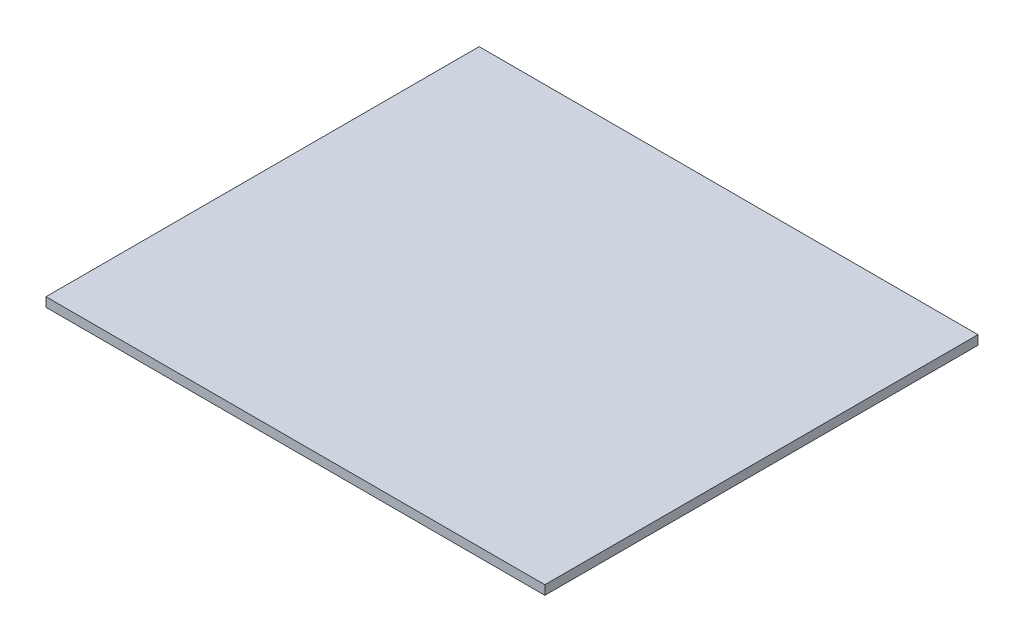
ISO-10303-21;
HEADER;
FILE_DESCRIPTION(('STEP AP214'),'2;1');
FILE_NAME('part.step','',(''),(''),'','','');
FILE_SCHEMA(('AUTOMOTIVE_DESIGN { 1 0 10303 214 1 1 1 1 }'));
ENDSEC;
DATA;
#1=APPLICATION_CONTEXT('core data for automotive mechanical design processes');
#2=APPLICATION_PROTOCOL_DEFINITION('international standard','automotive_design',2000,#1);
#3=PRODUCT_CONTEXT('',#1,'mechanical');
#4=PRODUCT('Part','Part','',(#3));
#5=PRODUCT_RELATED_PRODUCT_CATEGORY('part','',(#4));
#6=PRODUCT_DEFINITION_FORMATION('','',#4);
#7=PRODUCT_DEFINITION_CONTEXT('part definition',#1,'design');
#8=PRODUCT_DEFINITION('design','',#6,#7);
#9=PRODUCT_DEFINITION_SHAPE('','',#8);
#10=(LENGTH_UNIT() NAMED_UNIT(*) SI_UNIT(.MILLI.,.METRE.));
#11=(NAMED_UNIT(*) PLANE_ANGLE_UNIT() SI_UNIT($,.RADIAN.));
#12=(NAMED_UNIT(*) SI_UNIT($,.STERADIAN.) SOLID_ANGLE_UNIT());
#13=UNCERTAINTY_MEASURE_WITH_UNIT(LENGTH_MEASURE(1.E-05),#10,'distance_accuracy_value','');
#14=(GEOMETRIC_REPRESENTATION_CONTEXT(3) GLOBAL_UNCERTAINTY_ASSIGNED_CONTEXT((#13)) GLOBAL_UNIT_ASSIGNED_CONTEXT((#10,
#11,#12)) REPRESENTATION_CONTEXT('',''));
#15=CARTESIAN_POINT('',(0.,0.,0.));
#16=DIRECTION('',(0.,0.,1.));
#17=DIRECTION('',(1.,0.,0.));
#18=AXIS2_PLACEMENT_3D('',#15,#16,#17);
#19=CARTESIAN_POINT('',(515.874,19.05,-447.929));
#20=DIRECTION('',(-1.,0.,0.));
#21=DIRECTION('',(0.,0.,1.));
#22=AXIS2_PLACEMENT_3D('',#19,#20,#21);
#23=PLANE('',#22);
#24=DIRECTION('',(0.,0.,-1.));
#25=VECTOR('',#24,1.);
#26=CARTESIAN_POINT('',(515.874,0.,-447.929));
#27=LINE('',#26,#25);
#28=CARTESIAN_POINT('',(515.874,0.,447.929));
#29=VERTEX_POINT('',#28);
#30=CARTESIAN_POINT('',(515.874,0.,-447.929));
#31=VERTEX_POINT('',#30);
#32=EDGE_CURVE('E96',#29,#31,#27,.T.);
#33=ORIENTED_EDGE('',*,*,#32,.T.);
#34=DIRECTION('',(0.,-1.,0.));
#35=VECTOR('',#34,1.);
#36=CARTESIAN_POINT('',(515.874,19.05,-447.929));
#37=LINE('',#36,#35);
#38=CARTESIAN_POINT('',(515.874,19.05,-447.929));
#39=VERTEX_POINT('',#38);
#40=EDGE_CURVE('E11',#39,#31,#37,.T.);
#41=ORIENTED_EDGE('',*,*,#40,.F.);
#42=DIRECTION('',(0.,0.,-1.));
#43=VECTOR('',#42,1.);
#44=CARTESIAN_POINT('',(515.874,19.05,-447.929));
#45=LINE('',#44,#43);
#46=CARTESIAN_POINT('',(515.874,19.05,447.929));
#47=VERTEX_POINT('',#46);
#48=EDGE_CURVE('E84',#47,#39,#45,.T.);
#49=ORIENTED_EDGE('',*,*,#48,.F.);
#50=DIRECTION('',(0.,-1.,0.));
#51=VECTOR('',#50,1.);
#52=CARTESIAN_POINT('',(515.874,19.05,447.929));
#53=LINE('',#52,#51);
#54=EDGE_CURVE('E92',#47,#29,#53,.T.);
#55=ORIENTED_EDGE('',*,*,#54,.T.);
#56=EDGE_LOOP('',(#33,#41,#49,#55));
#57=FACE_BOUND('',#56,.T.);
#58=ADVANCED_FACE('F33',(#57),#23,.F.);
#59=CARTESIAN_POINT('',(-515.874,19.05,-447.929));
#60=DIRECTION('',(0.,0.,1.));
#61=DIRECTION('',(1.,0.,0.));
#62=AXIS2_PLACEMENT_3D('',#59,#60,#61);
#63=PLANE('',#62);
#64=DIRECTION('',(-1.,0.,0.));
#65=VECTOR('',#64,1.);
#66=CARTESIAN_POINT('',(-515.874,0.,-447.929));
#67=LINE('',#66,#65);
#68=CARTESIAN_POINT('',(-515.874,0.,-447.929));
#69=VERTEX_POINT('',#68);
#70=EDGE_CURVE('E88',#31,#69,#67,.T.);
#71=ORIENTED_EDGE('',*,*,#70,.T.);
#72=DIRECTION('',(0.,-1.,0.));
#73=VECTOR('',#72,1.);
#74=CARTESIAN_POINT('',(-515.874,19.05,-447.929));
#75=LINE('',#74,#73);
#76=CARTESIAN_POINT('',(-515.874,19.05,-447.929));
#77=VERTEX_POINT('',#76);
#78=EDGE_CURVE('E41',#77,#69,#75,.T.);
#79=ORIENTED_EDGE('',*,*,#78,.F.);
#80=DIRECTION('',(-1.,0.,0.));
#81=VECTOR('',#80,1.);
#82=CARTESIAN_POINT('',(-515.874,19.05,-447.929));
#83=LINE('',#82,#81);
#84=EDGE_CURVE('E79',#39,#77,#83,.T.);
#85=ORIENTED_EDGE('',*,*,#84,.F.);
#86=ORIENTED_EDGE('',*,*,#40,.T.);
#87=EDGE_LOOP('',(#71,#79,#85,#86));
#88=FACE_BOUND('',#87,.T.);
#89=ADVANCED_FACE('F87',(#88),#63,.F.);
#90=CARTESIAN_POINT('',(-515.874,19.05,-447.929));
#91=DIRECTION('',(1.,0.,0.));
#92=DIRECTION('',(0.,0.,-1.));
#93=AXIS2_PLACEMENT_3D('',#90,#91,#92);
#94=PLANE('',#93);
#95=DIRECTION('',(0.,0.,1.));
#96=VECTOR('',#95,1.);
#97=CARTESIAN_POINT('',(-515.874,0.,-447.929));
#98=LINE('',#97,#96);
#99=CARTESIAN_POINT('',(-515.874,0.,447.929));
#100=VERTEX_POINT('',#99);
#101=EDGE_CURVE('E66',#69,#100,#98,.T.);
#102=ORIENTED_EDGE('',*,*,#101,.T.);
#103=DIRECTION('',(0.,-1.,0.));
#104=VECTOR('',#103,1.);
#105=CARTESIAN_POINT('',(-515.874,19.05,447.929));
#106=LINE('',#105,#104);
#107=CARTESIAN_POINT('',(-515.874,19.05,447.929));
#108=VERTEX_POINT('',#107);
#109=EDGE_CURVE('E89',#108,#100,#106,.T.);
#110=ORIENTED_EDGE('',*,*,#109,.F.);
#111=DIRECTION('',(0.,0.,1.));
#112=VECTOR('',#111,1.);
#113=CARTESIAN_POINT('',(-515.874,19.05,-447.929));
#114=LINE('',#113,#112);
#115=EDGE_CURVE('E82',#77,#108,#114,.T.);
#116=ORIENTED_EDGE('',*,*,#115,.F.);
#117=ORIENTED_EDGE('',*,*,#78,.T.);
#118=EDGE_LOOP('',(#102,#110,#116,#117));
#119=FACE_BOUND('',#118,.T.);
#120=ADVANCED_FACE('F90',(#119),#94,.F.);
#121=CARTESIAN_POINT('',(-515.874,19.05,447.929));
#122=DIRECTION('',(0.,0.,-1.));
#123=DIRECTION('',(-1.,0.,0.));
#124=AXIS2_PLACEMENT_3D('',#121,#122,#123);
#125=PLANE('',#124);
#126=DIRECTION('',(1.,0.,0.));
#127=VECTOR('',#126,1.);
#128=CARTESIAN_POINT('',(-515.874,0.,447.929));
#129=LINE('',#128,#127);
#130=EDGE_CURVE('E72',#100,#29,#129,.T.);
#131=ORIENTED_EDGE('',*,*,#130,.T.);
#132=ORIENTED_EDGE('',*,*,#54,.F.);
#133=DIRECTION('',(1.,0.,0.));
#134=VECTOR('',#133,1.);
#135=CARTESIAN_POINT('',(-515.874,19.05,447.929));
#136=LINE('',#135,#134);
#137=EDGE_CURVE('E49',#108,#47,#136,.T.);
#138=ORIENTED_EDGE('',*,*,#137,.F.);
#139=ORIENTED_EDGE('',*,*,#109,.T.);
#140=EDGE_LOOP('',(#131,#132,#138,#139));
#141=FACE_BOUND('',#140,.T.);
#142=ADVANCED_FACE('F103',(#141),#125,.F.);
#143=CARTESIAN_POINT('',(0.,19.05,0.));
#144=DIRECTION('',(0.,1.,0.));
#145=DIRECTION('',(0.,0.,1.));
#146=AXIS2_PLACEMENT_3D('',#143,#144,#145);
#147=PLANE('',#146);
#148=ORIENTED_EDGE('',*,*,#48,.T.);
#149=ORIENTED_EDGE('',*,*,#84,.T.);
#150=ORIENTED_EDGE('',*,*,#115,.T.);
#151=ORIENTED_EDGE('',*,*,#137,.T.);
#152=EDGE_LOOP('',(#148,#149,#150,#151));
#153=FACE_BOUND('',#152,.T.);
#154=ADVANCED_FACE('F80',(#153),#147,.T.);
#155=CARTESIAN_POINT('',(0.,0.,0.));
#156=DIRECTION('',(0.,1.,0.));
#157=DIRECTION('',(0.,0.,1.));
#158=AXIS2_PLACEMENT_3D('',#155,#156,#157);
#159=PLANE('',#158);
#160=ORIENTED_EDGE('',*,*,#32,.F.);
#161=ORIENTED_EDGE('',*,*,#130,.F.);
#162=ORIENTED_EDGE('',*,*,#101,.F.);
#163=ORIENTED_EDGE('',*,*,#70,.F.);
#164=EDGE_LOOP('',(#160,#161,#162,#163));
#165=FACE_BOUND('',#164,.T.);
#166=ADVANCED_FACE('F106',(#165),#159,.F.);
#167=CLOSED_SHELL('',(#58,#89,#120,#142,#154,#166));
#168=MANIFOLD_SOLID_BREP('B2',#167);
#169=ADVANCED_BREP_SHAPE_REPRESENTATION('',(#18,#168),#14);
#170=SHAPE_DEFINITION_REPRESENTATION(#9,#169);
ENDSEC;
END-ISO-10303-21;
